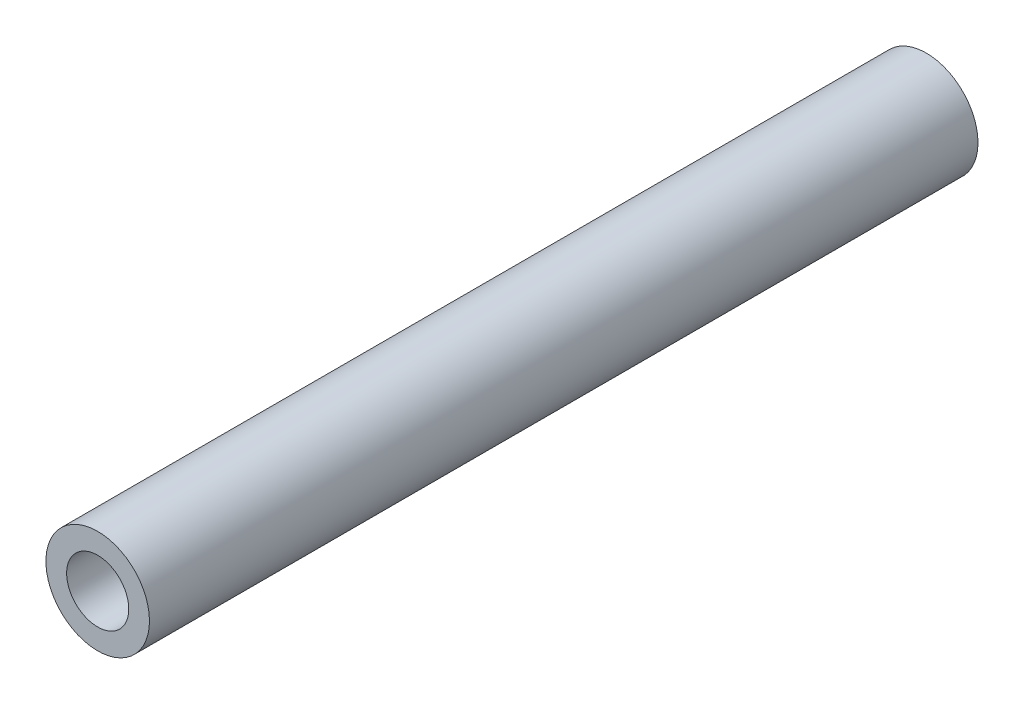
ISO-10303-21;
HEADER;
FILE_DESCRIPTION(('STEP AP214'),'2;1');
FILE_NAME('part.step','',(''),(''),'','','');
FILE_SCHEMA(('AUTOMOTIVE_DESIGN { 1 0 10303 214 1 1 1 1 }'));
ENDSEC;
DATA;
#1=APPLICATION_CONTEXT('core data for automotive mechanical design processes');
#2=APPLICATION_PROTOCOL_DEFINITION('international standard','automotive_design',2000,#1);
#3=PRODUCT_CONTEXT('',#1,'mechanical');
#4=PRODUCT('Part','Part','',(#3));
#5=PRODUCT_RELATED_PRODUCT_CATEGORY('part','',(#4));
#6=PRODUCT_DEFINITION_FORMATION('','',#4);
#7=PRODUCT_DEFINITION_CONTEXT('part definition',#1,'design');
#8=PRODUCT_DEFINITION('design','',#6,#7);
#9=PRODUCT_DEFINITION_SHAPE('','',#8);
#10=(LENGTH_UNIT() NAMED_UNIT(*) SI_UNIT(.MILLI.,.METRE.));
#11=(NAMED_UNIT(*) PLANE_ANGLE_UNIT() SI_UNIT($,.RADIAN.));
#12=(NAMED_UNIT(*) SI_UNIT($,.STERADIAN.) SOLID_ANGLE_UNIT());
#13=UNCERTAINTY_MEASURE_WITH_UNIT(LENGTH_MEASURE(1.E-05),#10,'distance_accuracy_value','');
#14=(GEOMETRIC_REPRESENTATION_CONTEXT(3) GLOBAL_UNCERTAINTY_ASSIGNED_CONTEXT((#13)) GLOBAL_UNIT_ASSIGNED_CONTEXT((#10,
#11,#12)) REPRESENTATION_CONTEXT('',''));
#15=CARTESIAN_POINT('',(0.,0.,0.));
#16=DIRECTION('',(0.,0.,1.));
#17=DIRECTION('',(1.,0.,0.));
#18=AXIS2_PLACEMENT_3D('',#15,#16,#17);
#19=CARTESIAN_POINT('',(0.,0.,20.));
#20=DIRECTION('',(0.,0.,1.));
#21=DIRECTION('',(1.,0.,0.));
#22=AXIS2_PLACEMENT_3D('',#19,#20,#21);
#23=PLANE('',#22);
#24=CARTESIAN_POINT('',(0.,0.,20.));
#25=DIRECTION('',(0.,0.,1.));
#26=DIRECTION('',(1.,0.,0.));
#27=AXIS2_PLACEMENT_3D('',#24,#25,#26);
#28=CIRCLE('',#27,2.5);
#29=CARTESIAN_POINT('',(2.5,0.,20.));
#30=VERTEX_POINT('',#29);
#31=EDGE_CURVE('E10',#30,#30,#28,.T.);
#32=ORIENTED_EDGE('',*,*,#31,.T.);
#33=EDGE_LOOP('',(#32));
#34=FACE_BOUND('',#33,.T.);
#35=CARTESIAN_POINT('',(0.,0.,20.));
#36=DIRECTION('',(0.,0.,1.));
#37=DIRECTION('',(1.,0.,0.));
#38=AXIS2_PLACEMENT_3D('',#35,#36,#37);
#39=CIRCLE('',#38,1.5);
#40=CARTESIAN_POINT('',(1.5,0.,20.));
#41=VERTEX_POINT('',#40);
#42=EDGE_CURVE('E42',#41,#41,#39,.T.);
#43=ORIENTED_EDGE('',*,*,#42,.F.);
#44=EDGE_LOOP('',(#43));
#45=FACE_BOUND('',#44,.T.);
#46=ADVANCED_FACE('F31',(#34,#45),#23,.T.);
#47=CARTESIAN_POINT('',(0.,0.,-20.));
#48=DIRECTION('',(0.,0.,1.));
#49=DIRECTION('',(1.,0.,0.));
#50=AXIS2_PLACEMENT_3D('',#47,#48,#49);
#51=PLANE('',#50);
#52=CARTESIAN_POINT('',(0.,0.,-20.));
#53=DIRECTION('',(0.,0.,1.));
#54=DIRECTION('',(1.,0.,0.));
#55=AXIS2_PLACEMENT_3D('',#52,#53,#54);
#56=CIRCLE('',#55,2.5);
#57=CARTESIAN_POINT('',(2.5,0.,-20.));
#58=VERTEX_POINT('',#57);
#59=EDGE_CURVE('E35',#58,#58,#56,.T.);
#60=ORIENTED_EDGE('',*,*,#59,.F.);
#61=EDGE_LOOP('',(#60));
#62=FACE_BOUND('',#61,.T.);
#63=CARTESIAN_POINT('',(0.,0.,-20.));
#64=DIRECTION('',(0.,0.,1.));
#65=DIRECTION('',(1.,0.,0.));
#66=AXIS2_PLACEMENT_3D('',#63,#64,#65);
#67=CIRCLE('',#66,1.5);
#68=CARTESIAN_POINT('',(1.5,0.,-20.));
#69=VERTEX_POINT('',#68);
#70=EDGE_CURVE('E44',#69,#69,#67,.T.);
#71=ORIENTED_EDGE('',*,*,#70,.T.);
#72=EDGE_LOOP('',(#71));
#73=FACE_BOUND('',#72,.T.);
#74=ADVANCED_FACE('F54',(#62,#73),#51,.F.);
#75=CARTESIAN_POINT('',(0.,0.,20.));
#76=DIRECTION('',(0.,0.,-1.));
#77=DIRECTION('',(-1.,0.,0.));
#78=AXIS2_PLACEMENT_3D('',#75,#76,#77);
#79=CYLINDRICAL_SURFACE('',#78,2.5);
#80=ORIENTED_EDGE('',*,*,#31,.F.);
#81=EDGE_LOOP('',(#80));
#82=FACE_BOUND('',#81,.T.);
#83=ORIENTED_EDGE('',*,*,#59,.T.);
#84=EDGE_LOOP('',(#83));
#85=FACE_BOUND('',#84,.T.);
#86=ADVANCED_FACE('F33',(#82,#85),#79,.T.);
#87=CARTESIAN_POINT('',(0.,0.,20.));
#88=DIRECTION('',(0.,0.,-1.));
#89=DIRECTION('',(-1.,0.,0.));
#90=AXIS2_PLACEMENT_3D('',#87,#88,#89);
#91=CYLINDRICAL_SURFACE('',#90,1.5);
#92=ORIENTED_EDGE('',*,*,#42,.T.);
#93=EDGE_LOOP('',(#92));
#94=FACE_BOUND('',#93,.T.);
#95=ORIENTED_EDGE('',*,*,#70,.F.);
#96=EDGE_LOOP('',(#95));
#97=FACE_BOUND('',#96,.T.);
#98=ADVANCED_FACE('F50',(#94,#97),#91,.F.);
#99=CLOSED_SHELL('',(#46,#74,#86,#98));
#100=MANIFOLD_SOLID_BREP('B2',#99);
#101=ADVANCED_BREP_SHAPE_REPRESENTATION('',(#18,#100),#14);
#102=SHAPE_DEFINITION_REPRESENTATION(#9,#101);
ENDSEC;
END-ISO-10303-21;
